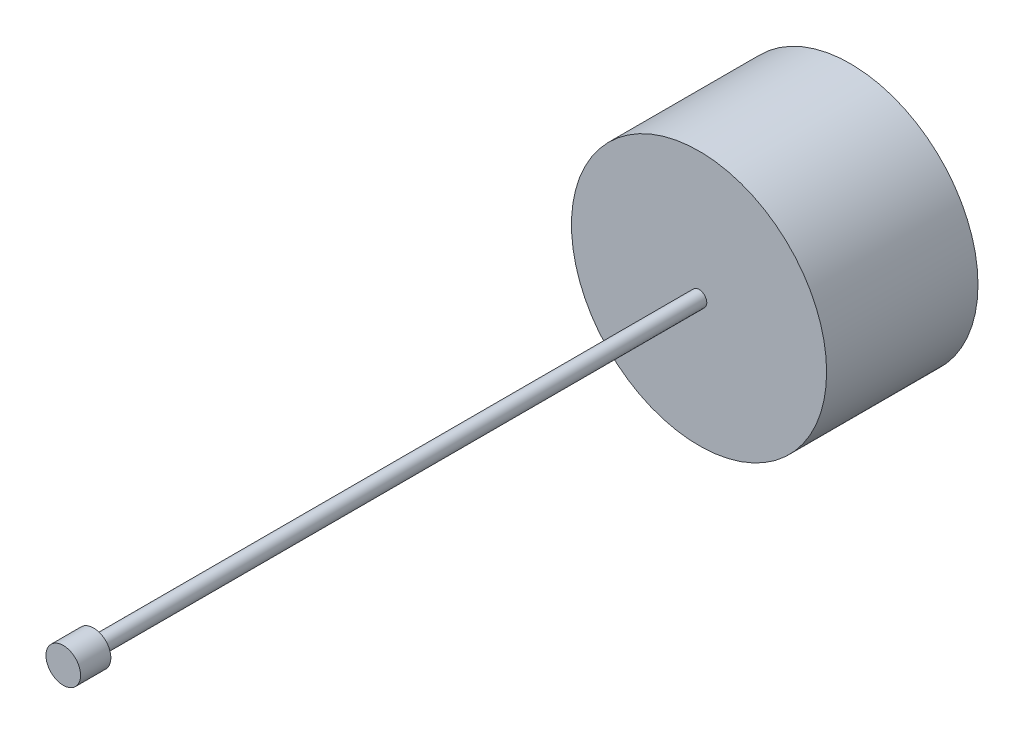
ISO-10303-21;
HEADER;
FILE_DESCRIPTION(('STEP AP214'),'2;1');
FILE_NAME('part.step','',(''),(''),'','','');
FILE_SCHEMA(('AUTOMOTIVE_DESIGN { 1 0 10303 214 1 1 1 1 }'));
ENDSEC;
DATA;
#1=APPLICATION_CONTEXT('core data for automotive mechanical design processes');
#2=APPLICATION_PROTOCOL_DEFINITION('international standard','automotive_design',2000,#1);
#3=PRODUCT_CONTEXT('',#1,'mechanical');
#4=PRODUCT('Part','Part','',(#3));
#5=PRODUCT_RELATED_PRODUCT_CATEGORY('part','',(#4));
#6=PRODUCT_DEFINITION_FORMATION('','',#4);
#7=PRODUCT_DEFINITION_CONTEXT('part definition',#1,'design');
#8=PRODUCT_DEFINITION('design','',#6,#7);
#9=PRODUCT_DEFINITION_SHAPE('','',#8);
#10=(LENGTH_UNIT() NAMED_UNIT(*) SI_UNIT(.MILLI.,.METRE.));
#11=(NAMED_UNIT(*) PLANE_ANGLE_UNIT() SI_UNIT($,.RADIAN.));
#12=(NAMED_UNIT(*) SI_UNIT($,.STERADIAN.) SOLID_ANGLE_UNIT());
#13=UNCERTAINTY_MEASURE_WITH_UNIT(LENGTH_MEASURE(1.E-05),#10,'distance_accuracy_value','');
#14=(GEOMETRIC_REPRESENTATION_CONTEXT(3) GLOBAL_UNCERTAINTY_ASSIGNED_CONTEXT((#13)) GLOBAL_UNIT_ASSIGNED_CONTEXT((#10,
#11,#12)) REPRESENTATION_CONTEXT('',''));
#15=CARTESIAN_POINT('',(0.,0.,0.));
#16=DIRECTION('',(0.,0.,1.));
#17=DIRECTION('',(1.,0.,0.));
#18=AXIS2_PLACEMENT_3D('',#15,#16,#17);
#19=CARTESIAN_POINT('',(0.,0.,35.));
#20=DIRECTION('',(0.,0.,-1.));
#21=DIRECTION('',(-1.,0.,0.));
#22=AXIS2_PLACEMENT_3D('',#19,#20,#21);
#23=CYLINDRICAL_SURFACE('',#22,29.5);
#24=CARTESIAN_POINT('',(0.,0.,35.));
#25=DIRECTION('',(0.,0.,1.));
#26=DIRECTION('',(1.,0.,0.));
#27=AXIS2_PLACEMENT_3D('',#24,#25,#26);
#28=CIRCLE('',#27,29.5);
#29=CARTESIAN_POINT('',(29.5,0.,35.));
#30=VERTEX_POINT('',#29);
#31=EDGE_CURVE('E10',#30,#30,#28,.T.);
#32=ORIENTED_EDGE('',*,*,#31,.F.);
#33=EDGE_LOOP('',(#32));
#34=FACE_BOUND('',#33,.T.);
#35=CARTESIAN_POINT('',(0.,0.,0.));
#36=DIRECTION('',(0.,0.,1.));
#37=DIRECTION('',(1.,0.,0.));
#38=AXIS2_PLACEMENT_3D('',#35,#36,#37);
#39=CIRCLE('',#38,29.5);
#40=CARTESIAN_POINT('',(29.5,0.,0.));
#41=VERTEX_POINT('',#40);
#42=EDGE_CURVE('E46',#41,#41,#39,.T.);
#43=ORIENTED_EDGE('',*,*,#42,.T.);
#44=EDGE_LOOP('',(#43));
#45=FACE_BOUND('',#44,.T.);
#46=ADVANCED_FACE('F43',(#34,#45),#23,.T.);
#47=CARTESIAN_POINT('',(0.,0.,35.));
#48=DIRECTION('',(0.,0.,1.));
#49=DIRECTION('',(1.,0.,0.));
#50=AXIS2_PLACEMENT_3D('',#47,#48,#49);
#51=PLANE('',#50);
#52=CARTESIAN_POINT('',(0.,0.,35.));
#53=DIRECTION('',(0.,0.,1.));
#54=DIRECTION('',(1.,0.,0.));
#55=AXIS2_PLACEMENT_3D('',#52,#53,#54);
#56=CIRCLE('',#55,1.7907);
#57=CARTESIAN_POINT('',(1.7907,0.,35.));
#58=VERTEX_POINT('',#57);
#59=EDGE_CURVE('E60',#58,#58,#56,.T.);
#60=ORIENTED_EDGE('',*,*,#59,.F.);
#61=EDGE_LOOP('',(#60));
#62=FACE_BOUND('',#61,.T.);
#63=ORIENTED_EDGE('',*,*,#31,.T.);
#64=EDGE_LOOP('',(#63));
#65=FACE_BOUND('',#64,.T.);
#66=ADVANCED_FACE('F93',(#62,#65),#51,.T.);
#67=CARTESIAN_POINT('',(0.,0.,0.));
#68=DIRECTION('',(0.,0.,1.));
#69=DIRECTION('',(1.,0.,0.));
#70=AXIS2_PLACEMENT_3D('',#67,#68,#69);
#71=PLANE('',#70);
#72=ORIENTED_EDGE('',*,*,#42,.F.);
#73=EDGE_LOOP('',(#72));
#74=FACE_BOUND('',#73,.T.);
#75=ADVANCED_FACE('F100',(#74),#71,.F.);
#76=CARTESIAN_POINT('',(0.,0.,175.));
#77=DIRECTION('',(0.,0.,-1.));
#78=DIRECTION('',(-1.,0.,0.));
#79=AXIS2_PLACEMENT_3D('',#76,#77,#78);
#80=CYLINDRICAL_SURFACE('',#79,1.7907);
#81=CARTESIAN_POINT('',(0.,0.,175.));
#82=DIRECTION('',(0.,0.,1.));
#83=DIRECTION('',(1.,0.,0.));
#84=AXIS2_PLACEMENT_3D('',#81,#82,#83);
#85=CIRCLE('',#84,1.7907);
#86=CARTESIAN_POINT('',(1.7907,0.,175.));
#87=VERTEX_POINT('',#86);
#88=EDGE_CURVE('E54',#87,#87,#85,.T.);
#89=ORIENTED_EDGE('',*,*,#88,.F.);
#90=EDGE_LOOP('',(#89));
#91=FACE_BOUND('',#90,.T.);
#92=ORIENTED_EDGE('',*,*,#59,.T.);
#93=EDGE_LOOP('',(#92));
#94=FACE_BOUND('',#93,.T.);
#95=ADVANCED_FACE('F79',(#91,#94),#80,.T.);
#96=CARTESIAN_POINT('',(0.,0.,182.));
#97=DIRECTION('',(0.,0.,-1.));
#98=DIRECTION('',(-1.,0.,0.));
#99=AXIS2_PLACEMENT_3D('',#96,#97,#98);
#100=CYLINDRICAL_SURFACE('',#99,4.);
#101=CARTESIAN_POINT('',(0.,0.,182.));
#102=DIRECTION('',(0.,0.,1.));
#103=DIRECTION('',(1.,0.,0.));
#104=AXIS2_PLACEMENT_3D('',#101,#102,#103);
#105=CIRCLE('',#104,4.);
#106=CARTESIAN_POINT('',(4.,0.,182.));
#107=VERTEX_POINT('',#106);
#108=EDGE_CURVE('E62',#107,#107,#105,.T.);
#109=ORIENTED_EDGE('',*,*,#108,.F.);
#110=EDGE_LOOP('',(#109));
#111=FACE_BOUND('',#110,.T.);
#112=CARTESIAN_POINT('',(0.,0.,175.));
#113=DIRECTION('',(0.,0.,1.));
#114=DIRECTION('',(1.,0.,0.));
#115=AXIS2_PLACEMENT_3D('',#112,#113,#114);
#116=CIRCLE('',#115,4.);
#117=CARTESIAN_POINT('',(4.,0.,175.));
#118=VERTEX_POINT('',#117);
#119=EDGE_CURVE('E63',#118,#118,#116,.T.);
#120=ORIENTED_EDGE('',*,*,#119,.T.);
#121=EDGE_LOOP('',(#120));
#122=FACE_BOUND('',#121,.T.);
#123=ADVANCED_FACE('F73',(#111,#122),#100,.T.);
#124=CARTESIAN_POINT('',(0.,0.,182.));
#125=DIRECTION('',(0.,0.,1.));
#126=DIRECTION('',(1.,0.,0.));
#127=AXIS2_PLACEMENT_3D('',#124,#125,#126);
#128=PLANE('',#127);
#129=ORIENTED_EDGE('',*,*,#108,.T.);
#130=EDGE_LOOP('',(#129));
#131=FACE_BOUND('',#130,.T.);
#132=ADVANCED_FACE('F71',(#131),#128,.T.);
#133=CARTESIAN_POINT('',(0.,0.,175.));
#134=DIRECTION('',(0.,0.,1.));
#135=DIRECTION('',(1.,0.,0.));
#136=AXIS2_PLACEMENT_3D('',#133,#134,#135);
#137=PLANE('',#136);
#138=ORIENTED_EDGE('',*,*,#88,.T.);
#139=EDGE_LOOP('',(#138));
#140=FACE_BOUND('',#139,.T.);
#141=ORIENTED_EDGE('',*,*,#119,.F.);
#142=EDGE_LOOP('',(#141));
#143=FACE_BOUND('',#142,.T.);
#144=ADVANCED_FACE('F84',(#140,#143),#137,.F.);
#145=CLOSED_SHELL('',(#46,#66,#75,#95,#123,#132,#144));
#146=MANIFOLD_SOLID_BREP('B2',#145);
#147=ADVANCED_BREP_SHAPE_REPRESENTATION('',(#18,#146),#14);
#148=SHAPE_DEFINITION_REPRESENTATION(#9,#147);
ENDSEC;
END-ISO-10303-21;
